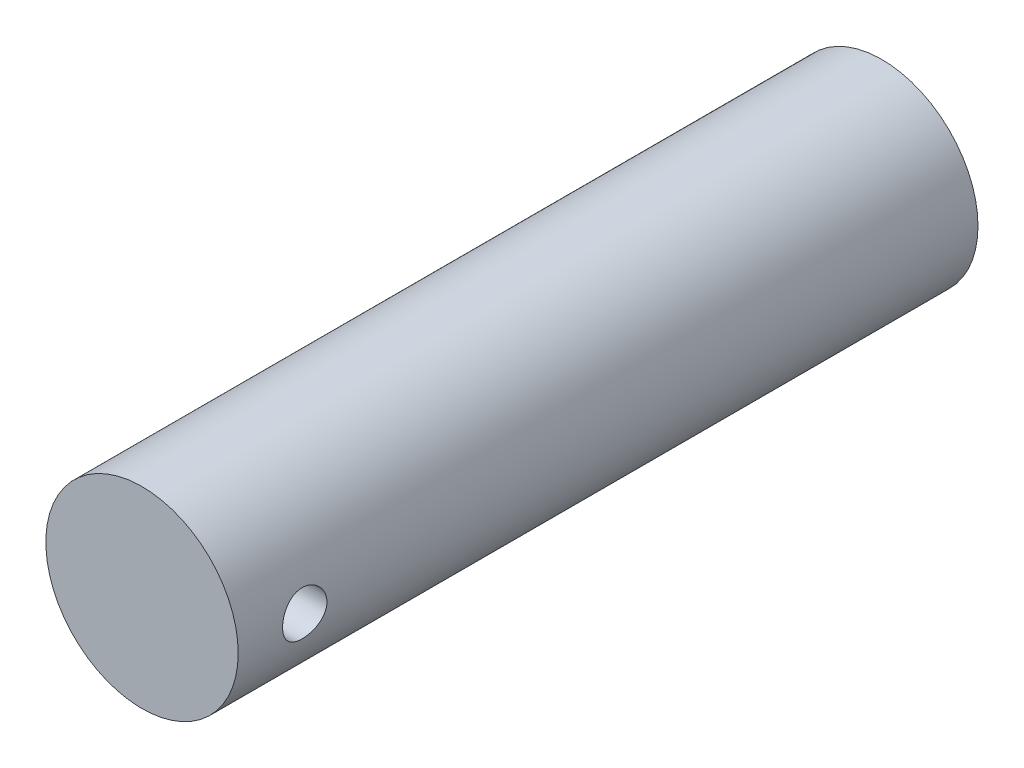
ISO-10303-21;
HEADER;
FILE_DESCRIPTION(('STEP AP214'),'2;1');
FILE_NAME('part.step','',(''),(''),'','','');
FILE_SCHEMA(('AUTOMOTIVE_DESIGN { 1 0 10303 214 1 1 1 1 }'));
ENDSEC;
DATA;
#1=APPLICATION_CONTEXT('core data for automotive mechanical design processes');
#2=APPLICATION_PROTOCOL_DEFINITION('international standard','automotive_design',2000,#1);
#3=PRODUCT_CONTEXT('',#1,'mechanical');
#4=PRODUCT('Part','Part','',(#3));
#5=PRODUCT_RELATED_PRODUCT_CATEGORY('part','',(#4));
#6=PRODUCT_DEFINITION_FORMATION('','',#4);
#7=PRODUCT_DEFINITION_CONTEXT('part definition',#1,'design');
#8=PRODUCT_DEFINITION('design','',#6,#7);
#9=PRODUCT_DEFINITION_SHAPE('','',#8);
#10=(LENGTH_UNIT() NAMED_UNIT(*) SI_UNIT(.MILLI.,.METRE.));
#11=(NAMED_UNIT(*) PLANE_ANGLE_UNIT() SI_UNIT($,.RADIAN.));
#12=(NAMED_UNIT(*) SI_UNIT($,.STERADIAN.) SOLID_ANGLE_UNIT());
#13=UNCERTAINTY_MEASURE_WITH_UNIT(LENGTH_MEASURE(1.E-05),#10,'distance_accuracy_value','');
#14=(GEOMETRIC_REPRESENTATION_CONTEXT(3) GLOBAL_UNCERTAINTY_ASSIGNED_CONTEXT((#13)) GLOBAL_UNIT_ASSIGNED_CONTEXT((#10,
#11,#12)) REPRESENTATION_CONTEXT('',''));
#15=CARTESIAN_POINT('',(0.,0.,0.));
#16=DIRECTION('',(0.,0.,1.));
#17=DIRECTION('',(1.,0.,0.));
#18=AXIS2_PLACEMENT_3D('',#15,#16,#17);
#19=CARTESIAN_POINT('',(0.,0.,50.));
#20=DIRECTION('',(0.,0.,-1.));
#21=DIRECTION('',(-1.,0.,0.));
#22=AXIS2_PLACEMENT_3D('',#19,#20,#21);
#23=CYLINDRICAL_SURFACE('',#22,6.5);
#24=CARTESIAN_POINT('',(-6.5,0.,44.));
#25=CARTESIAN_POINT('',(-6.49999849532867,0.0830761724763349,44.0000026653559));
#26=CARTESIAN_POINT('',(-6.49839124214547,0.166183602986828,44.0069249268111));
#27=CARTESIAN_POINT('',(-6.49213500375529,0.330029933246628,44.0343976428857));
#28=CARTESIAN_POINT('',(-6.48748401185166,0.410767233683363,44.0549570884414));
#29=CARTESIAN_POINT('',(-6.47565710646771,0.567482400649438,44.1090196989409));
#30=CARTESIAN_POINT('',(-6.46848397910972,0.643465410431955,44.1425085851314));
#31=CARTESIAN_POINT('',(-6.45238316831829,0.788732955280499,44.2214322650684));
#32=CARTESIAN_POINT('',(-6.44345549077589,0.858017512835939,44.2668670187059));
#33=CARTESIAN_POINT('',(-6.42464323305021,0.989152353123209,44.3692452516772));
#34=CARTESIAN_POINT('',(-6.41474568654138,1.05086679216121,44.4263603617025));
#35=CARTESIAN_POINT('',(-6.39519859507266,1.16393060397695,44.5501099265713));
#36=CARTESIAN_POINT('',(-6.38554907436474,1.2152789664991,44.6167453081605));
#37=CARTESIAN_POINT('',(-6.36746174180576,1.3067669575256,44.7586669275603));
#38=CARTESIAN_POINT('',(-6.35904049089481,1.34675925477788,44.8340504409768));
#39=CARTESIAN_POINT('',(-6.34455046029963,1.41345395330062,44.9906950986506));
#40=CARTESIAN_POINT('',(-6.33848136485541,1.44015813854149,45.0719554522451));
#41=CARTESIAN_POINT('',(-6.32951534623235,1.4790642425856,45.2365658015827));
#42=CARTESIAN_POINT('',(-6.32656557105072,1.4915080949688,45.3198556733748));
#43=CARTESIAN_POINT('',(-6.32401364937952,1.50229307046533,45.4873890870456));
#44=CARTESIAN_POINT('',(-6.32441104286173,1.50063613156309,45.5716324962828));
#45=CARTESIAN_POINT('',(-6.32846083321139,1.48346063285704,45.7368628078238));
#46=CARTESIAN_POINT('',(-6.33204661249555,1.46822575315179,45.8178810813439));
#47=CARTESIAN_POINT('',(-6.34196351386388,1.42477741479348,45.9761797919016));
#48=CARTESIAN_POINT('',(-6.34829480548987,1.39656315462671,46.0534599977771));
#49=CARTESIAN_POINT('',(-6.36305332227188,1.32770349075047,46.2028726716409));
#50=CARTESIAN_POINT('',(-6.37149843240945,1.28695129246528,46.274954080911));
#51=CARTESIAN_POINT('',(-6.38952239681953,1.19424748975256,46.4113592362894));
#52=CARTESIAN_POINT('',(-6.39910142196225,1.14229419645531,46.475681810259));
#53=CARTESIAN_POINT('',(-6.41859777640792,1.02717321086453,46.596373950051));
#54=CARTESIAN_POINT('',(-6.42851768847712,0.963764950845058,46.652513885125));
#55=CARTESIAN_POINT('',(-6.447368160694,0.828318641053408,46.7534030709754));
#56=CARTESIAN_POINT('',(-6.45629869876005,0.756280398745031,46.7981520675486));
#57=CARTESIAN_POINT('',(-6.47219854082993,0.605321277972372,46.8750559141433));
#58=CARTESIAN_POINT('',(-6.47916273202417,0.52638314329425,46.9071780156927));
#59=CARTESIAN_POINT('',(-6.49030757986402,0.364032396252585,46.9576361436951));
#60=CARTESIAN_POINT('',(-6.49448868821629,0.28062051237424,46.9759744073885));
#61=CARTESIAN_POINT('',(-6.49953102945198,0.113657323931641,46.9980041503482));
#62=CARTESIAN_POINT('',(-6.50046326526885,0.0301494450127298,47.0020089360597));
#63=CARTESIAN_POINT('',(-6.49910299913129,-0.136342371579224,46.9961109852407));
#64=CARTESIAN_POINT('',(-6.49681074208307,-0.219326348562746,46.986209304932));
#65=CARTESIAN_POINT('',(-6.48930412349636,-0.381357903798024,46.9530388033943));
#66=CARTESIAN_POINT('',(-6.48412623941868,-0.4604414648757,46.9299367586829));
#67=CARTESIAN_POINT('',(-6.47142910428788,-0.613609622481664,46.8712084110756));
#68=CARTESIAN_POINT('',(-6.4639096389422,-0.687693760726587,46.8355809618642));
#69=CARTESIAN_POINT('',(-6.44718996088191,-0.830037615110188,46.752177356079));
#70=CARTESIAN_POINT('',(-6.43796535296184,-0.898188410296328,46.7042203081148));
#71=CARTESIAN_POINT('',(-6.41890391913982,-1.02558718048179,46.5977543826415));
#72=CARTESIAN_POINT('',(-6.40906700421673,-1.08483385664763,46.5392439684584));
#73=CARTESIAN_POINT('',(-6.38964047483402,-1.19400102833017,46.411887614121));
#74=CARTESIAN_POINT('',(-6.38006017503739,-1.24370343589042,46.3428530353226));
#75=CARTESIAN_POINT('',(-6.36246188496285,-1.3308123544641,46.1972341197847));
#76=CARTESIAN_POINT('',(-6.35444382521927,-1.3682194122462,46.1206501189616));
#77=CARTESIAN_POINT('',(-6.34095951164845,-1.4294106686813,45.9625240115775));
#78=CARTESIAN_POINT('',(-6.33547846174878,-1.45327404481083,45.8810138703166));
#79=CARTESIAN_POINT('',(-6.3276660054956,-1.48692530676327,45.7149960071522));
#80=CARTESIAN_POINT('',(-6.32533402889436,-1.49671574099563,45.63048883081));
#81=CARTESIAN_POINT('',(-6.32412253425542,-1.50182536015786,45.4630817729474));
#82=CARTESIAN_POINT('',(-6.32516029248235,-1.49749127871472,45.3801928893514));
#83=CARTESIAN_POINT('',(-6.33038270361014,-1.47525685980882,45.2163613213318));
#84=CARTESIAN_POINT('',(-6.33456731037362,-1.45735672124419,45.1354186083924));
#85=CARTESIAN_POINT('',(-6.34556939165105,-1.40867420720144,44.9780900892089));
#86=CARTESIAN_POINT('',(-6.35237543592818,-1.37794771033572,44.9016861392942));
#87=CARTESIAN_POINT('',(-6.36785683112448,-1.30453082227101,44.7550681934587));
#88=CARTESIAN_POINT('',(-6.37653240158127,-1.26183902581515,44.6848549258726));
#89=CARTESIAN_POINT('',(-6.39501829374306,-1.16457679516264,44.5509144714099));
#90=CARTESIAN_POINT('',(-6.4048496868242,-1.10976162033288,44.4873678804504));
#91=CARTESIAN_POINT('',(-6.42440402438128,-0.990297714593216,44.3702617523617));
#92=CARTESIAN_POINT('',(-6.43412694306169,-0.925646696024382,44.3167045450697));
#93=CARTESIAN_POINT('',(-6.45253999299533,-0.787191932761555,44.2203327320512));
#94=CARTESIAN_POINT('',(-6.46121270567525,-0.71326686908489,44.1776888817102));
#95=CARTESIAN_POINT('',(-6.47637045552876,-0.559109641475373,44.1055008505914));
#96=CARTESIAN_POINT('',(-6.48285722936411,-0.478882547101938,44.0759462648971));
#97=CARTESIAN_POINT('',(-6.49182723396727,-0.33221037419877,44.0357215264443));
#98=CARTESIAN_POINT('',(-6.49487228966801,-0.26652636732101,44.022352728973));
#99=CARTESIAN_POINT('',(-6.4989592245111,-0.133901630280836,44.0044911333853));
#100=CARTESIAN_POINT('',(-6.5000012127936,-0.0669609687898311,43.9999978516727));
#101=CARTESIAN_POINT('',(-6.5,0.,44.));
#102=B_SPLINE_CURVE_WITH_KNOTS('',3,(#24,#25,#26,#27,#28,#29,#30,#31,#32,#33,#34,#35,#36,#37,
#38,#39,#40,#41,#42,#43,#44,#45,#46,#47,#48,#49,#50,#51,#52,#53,#54,#55,#56,#57,#58,#59,#60,#61,
#62,#63,#64,#65,#66,#67,#68,#69,#70,#71,#72,#73,#74,#75,#76,#77,#78,#79,#80,#81,#82,#83,#84,#85,
#86,#87,#88,#89,#90,#91,#92,#93,#94,#95,#96,#97,#98,#99,#100,#101),.UNSPECIFIED.,.T.,.F.,(4,2,2,
2,2,2,2,2,2,2,2,2,2,2,2,2,2,2,2,2,2,2,2,2,2,2,2,2,2,2,2,2,2,2,2,2,2,2,4),(0.,0.248983311217115,
0.4981309394311,0.747004202472743,0.9958766299172,1.24870930222222,1.50156660317464,
1.75756840109411,2.01353582069621,2.26509316141456,2.51661592915603,2.76300377758328,
3.00940684320485,3.25796969712266,3.50657005489343,3.76117526279511,4.01578615203543,
4.27105309773003,4.52627860236007,4.77589001432917,5.02548246887372,5.27198911757479,
5.51851833225483,5.76889433751053,6.01930682944869,6.27489540554878,6.53047261420163,
6.78453988631542,7.03856114466418,7.28639401438668,7.53422325058919,7.78098389306532,
8.02777352833803,8.28009323709709,8.53247172133004,8.78858609727299,9.04449651578223,
9.24519271684378,9.44587798236137),.UNSPECIFIED.);
#103=CARTESIAN_POINT('',(-6.5,0.,44.));
#104=VERTEX_POINT('',#103);
#105=EDGE_CURVE('E10',#104,#104,#102,.T.);
#106=ORIENTED_EDGE('',*,*,#105,.T.);
#107=EDGE_LOOP('',(#106));
#108=FACE_BOUND('',#107,.T.);
#109=CARTESIAN_POINT('',(6.5,0.,44.));
#110=CARTESIAN_POINT('',(6.49999849532867,-0.0830761724763349,44.0000026653559));
#111=CARTESIAN_POINT('',(6.49839124214547,-0.166183602986828,44.0069249268111));
#112=CARTESIAN_POINT('',(6.49213500375529,-0.330029933246628,44.0343976428857));
#113=CARTESIAN_POINT('',(6.48748401185166,-0.410767233683363,44.0549570884414));
#114=CARTESIAN_POINT('',(6.47565710646771,-0.567482400649438,44.1090196989409));
#115=CARTESIAN_POINT('',(6.46848397910972,-0.643465410431955,44.1425085851314));
#116=CARTESIAN_POINT('',(6.45238316831829,-0.788732955280499,44.2214322650684));
#117=CARTESIAN_POINT('',(6.44345549077589,-0.858017512835939,44.2668670187059));
#118=CARTESIAN_POINT('',(6.42464323305021,-0.989152353123208,44.3692452516772));
#119=CARTESIAN_POINT('',(6.41474568654138,-1.0508667921612,44.4263603617025));
#120=CARTESIAN_POINT('',(6.39519859507266,-1.16393060397695,44.5501099265713));
#121=CARTESIAN_POINT('',(6.38554907436474,-1.2152789664991,44.6167453081605));
#122=CARTESIAN_POINT('',(6.36746174180576,-1.3067669575256,44.7586669275603));
#123=CARTESIAN_POINT('',(6.35904049089481,-1.34675925477788,44.8340504409768));
#124=CARTESIAN_POINT('',(6.34455046029963,-1.41345395330062,44.9906950986506));
#125=CARTESIAN_POINT('',(6.33848136485541,-1.44015813854149,45.0719554522451));
#126=CARTESIAN_POINT('',(6.32951534623235,-1.4790642425856,45.2365658015827));
#127=CARTESIAN_POINT('',(6.32656557105072,-1.4915080949688,45.3198556733748));
#128=CARTESIAN_POINT('',(6.32401364937952,-1.50229307046533,45.4873890870456));
#129=CARTESIAN_POINT('',(6.32441104286173,-1.50063613156309,45.5716324962828));
#130=CARTESIAN_POINT('',(6.32846083321139,-1.48346063285704,45.7368628078238));
#131=CARTESIAN_POINT('',(6.33204661249555,-1.46822575315179,45.8178810813439));
#132=CARTESIAN_POINT('',(6.34196351386388,-1.42477741479348,45.9761797919016));
#133=CARTESIAN_POINT('',(6.34829480548987,-1.39656315462671,46.0534599977771));
#134=CARTESIAN_POINT('',(6.36305332227188,-1.32770349075047,46.2028726716409));
#135=CARTESIAN_POINT('',(6.37149843240945,-1.28695129246528,46.274954080911));
#136=CARTESIAN_POINT('',(6.38952239681953,-1.19424748975256,46.4113592362894));
#137=CARTESIAN_POINT('',(6.39910142196225,-1.14229419645531,46.475681810259));
#138=CARTESIAN_POINT('',(6.41859777640792,-1.02717321086453,46.596373950051));
#139=CARTESIAN_POINT('',(6.42851768847712,-0.963764950845058,46.652513885125));
#140=CARTESIAN_POINT('',(6.447368160694,-0.828318641053408,46.7534030709754));
#141=CARTESIAN_POINT('',(6.45629869876005,-0.756280398745031,46.7981520675486));
#142=CARTESIAN_POINT('',(6.47219854082993,-0.605321277972372,46.8750559141433));
#143=CARTESIAN_POINT('',(6.47916273202417,-0.52638314329425,46.9071780156927));
#144=CARTESIAN_POINT('',(6.49030757986402,-0.364032396252585,46.9576361436951));
#145=CARTESIAN_POINT('',(6.49448868821629,-0.28062051237424,46.9759744073885));
#146=CARTESIAN_POINT('',(6.49953102945198,-0.113657323931641,46.9980041503482));
#147=CARTESIAN_POINT('',(6.50046326526885,-0.0301494450127298,47.0020089360597));
#148=CARTESIAN_POINT('',(6.49910299913129,0.136342371579224,46.9961109852407));
#149=CARTESIAN_POINT('',(6.49681074208307,0.219326348562746,46.986209304932));
#150=CARTESIAN_POINT('',(6.48930412349636,0.381357903798024,46.9530388033943));
#151=CARTESIAN_POINT('',(6.48412623941868,0.4604414648757,46.9299367586829));
#152=CARTESIAN_POINT('',(6.47142910428788,0.613609622481664,46.8712084110756));
#153=CARTESIAN_POINT('',(6.4639096389422,0.687693760726587,46.8355809618642));
#154=CARTESIAN_POINT('',(6.44718996088191,0.830037615110188,46.752177356079));
#155=CARTESIAN_POINT('',(6.43796535296184,0.898188410296328,46.7042203081148));
#156=CARTESIAN_POINT('',(6.41890391913982,1.02558718048179,46.5977543826415));
#157=CARTESIAN_POINT('',(6.40906700421673,1.08483385664763,46.5392439684584));
#158=CARTESIAN_POINT('',(6.38964047483402,1.19400102833017,46.411887614121));
#159=CARTESIAN_POINT('',(6.38006017503739,1.24370343589042,46.3428530353226));
#160=CARTESIAN_POINT('',(6.36246188496285,1.3308123544641,46.1972341197847));
#161=CARTESIAN_POINT('',(6.35444382521927,1.3682194122462,46.1206501189616));
#162=CARTESIAN_POINT('',(6.34095951164845,1.4294106686813,45.9625240115775));
#163=CARTESIAN_POINT('',(6.33547846174878,1.45327404481083,45.8810138703166));
#164=CARTESIAN_POINT('',(6.3276660054956,1.48692530676327,45.7149960071522));
#165=CARTESIAN_POINT('',(6.32533402889436,1.49671574099563,45.63048883081));
#166=CARTESIAN_POINT('',(6.32412253425542,1.50182536015786,45.4630817729474));
#167=CARTESIAN_POINT('',(6.32516029248235,1.49749127871472,45.3801928893514));
#168=CARTESIAN_POINT('',(6.33038270361014,1.47525685980882,45.2163613213318));
#169=CARTESIAN_POINT('',(6.33456731037362,1.45735672124419,45.1354186083924));
#170=CARTESIAN_POINT('',(6.34556939165105,1.40867420720144,44.9780900892089));
#171=CARTESIAN_POINT('',(6.35237543592818,1.37794771033572,44.9016861392942));
#172=CARTESIAN_POINT('',(6.36785683112448,1.30453082227101,44.7550681934587));
#173=CARTESIAN_POINT('',(6.37653240158127,1.26183902581515,44.6848549258726));
#174=CARTESIAN_POINT('',(6.39501829374306,1.16457679516264,44.5509144714099));
#175=CARTESIAN_POINT('',(6.4048496868242,1.10976162033288,44.4873678804504));
#176=CARTESIAN_POINT('',(6.42440402438128,0.990297714593216,44.3702617523617));
#177=CARTESIAN_POINT('',(6.43412694306169,0.925646696024382,44.3167045450697));
#178=CARTESIAN_POINT('',(6.45253999299533,0.787191932761555,44.2203327320512));
#179=CARTESIAN_POINT('',(6.46121270567525,0.71326686908489,44.1776888817102));
#180=CARTESIAN_POINT('',(6.47637045552876,0.559109641475373,44.1055008505914));
#181=CARTESIAN_POINT('',(6.48285722936411,0.478882547101938,44.0759462648971));
#182=CARTESIAN_POINT('',(6.49182723396727,0.33221037419877,44.0357215264443));
#183=CARTESIAN_POINT('',(6.49487228966801,0.26652636732101,44.022352728973));
#184=CARTESIAN_POINT('',(6.4989592245111,0.133901630280836,44.0044911333853));
#185=CARTESIAN_POINT('',(6.5000012127936,0.0669609687898311,43.9999978516727));
#186=CARTESIAN_POINT('',(6.5,0.,44.));
#187=B_SPLINE_CURVE_WITH_KNOTS('',3,(#109,#110,#111,#112,#113,#114,#115,#116,#117,#118,#119,
#120,#121,#122,#123,#124,#125,#126,#127,#128,#129,#130,#131,#132,#133,#134,#135,#136,#137,#138,
#139,#140,#141,#142,#143,#144,#145,#146,#147,#148,#149,#150,#151,#152,#153,#154,#155,#156,#157,
#158,#159,#160,#161,#162,#163,#164,#165,#166,#167,#168,#169,#170,#171,#172,#173,#174,#175,#176,
#177,#178,#179,#180,#181,#182,#183,#184,#185,#186),.UNSPECIFIED.,.T.,.F.,(4,2,2,2,2,2,2,2,2,2,2,
2,2,2,2,2,2,2,2,2,2,2,2,2,2,2,2,2,2,2,2,2,2,2,2,2,2,2,4),(0.,0.248983311217115,0.4981309394311,
0.747004202472743,0.9958766299172,1.24870930222221,1.50156660317464,1.75756840109411,
2.01353582069621,2.26509316141457,2.51661592915603,2.76300377758328,3.00940684320485,
3.25796969712266,3.50657005489343,3.76117526279511,4.01578615203544,4.27105309773003,
4.52627860236007,4.77589001432917,5.02548246887372,5.27198911757479,5.51851833225483,
5.76889433751053,6.01930682944869,6.27489540554879,6.53047261420163,6.78453988631542,
7.03856114466418,7.28639401438668,7.53422325058919,7.78098389306532,8.02777352833803,
8.28009323709709,8.53247172133004,8.78858609727299,9.04449651578223,9.24519271684378,
9.44587798236137),.UNSPECIFIED.);
#188=CARTESIAN_POINT('',(6.5,0.,44.));
#189=VERTEX_POINT('',#188);
#190=EDGE_CURVE('E40',#189,#189,#187,.T.);
#191=ORIENTED_EDGE('',*,*,#190,.T.);
#192=EDGE_LOOP('',(#191));
#193=FACE_BOUND('',#192,.T.);
#194=CARTESIAN_POINT('',(0.,0.,50.));
#195=DIRECTION('',(0.,0.,1.));
#196=DIRECTION('',(1.,0.,0.));
#197=AXIS2_PLACEMENT_3D('',#194,#195,#196);
#198=CIRCLE('',#197,6.5);
#199=CARTESIAN_POINT('',(6.5,0.,50.));
#200=VERTEX_POINT('',#199);
#201=EDGE_CURVE('E44',#200,#200,#198,.T.);
#202=ORIENTED_EDGE('',*,*,#201,.F.);
#203=EDGE_LOOP('',(#202));
#204=FACE_BOUND('',#203,.T.);
#205=CARTESIAN_POINT('',(0.,0.,0.));
#206=DIRECTION('',(0.,0.,1.));
#207=DIRECTION('',(1.,0.,0.));
#208=AXIS2_PLACEMENT_3D('',#205,#206,#207);
#209=CIRCLE('',#208,6.5);
#210=CARTESIAN_POINT('',(6.5,0.,0.));
#211=VERTEX_POINT('',#210);
#212=EDGE_CURVE('E48',#211,#211,#209,.T.);
#213=ORIENTED_EDGE('',*,*,#212,.T.);
#214=EDGE_LOOP('',(#213));
#215=FACE_BOUND('',#214,.T.);
#216=ADVANCED_FACE('F30',(#108,#193,#204,#215),#23,.T.);
#217=CARTESIAN_POINT('',(0.,0.,50.));
#218=DIRECTION('',(0.,0.,1.));
#219=DIRECTION('',(1.,0.,0.));
#220=AXIS2_PLACEMENT_3D('',#217,#218,#219);
#221=PLANE('',#220);
#222=ORIENTED_EDGE('',*,*,#201,.T.);
#223=EDGE_LOOP('',(#222));
#224=FACE_BOUND('',#223,.T.);
#225=ADVANCED_FACE('F59',(#224),#221,.T.);
#226=CARTESIAN_POINT('',(0.,0.,0.));
#227=DIRECTION('',(0.,0.,1.));
#228=DIRECTION('',(1.,0.,0.));
#229=AXIS2_PLACEMENT_3D('',#226,#227,#228);
#230=PLANE('',#229);
#231=ORIENTED_EDGE('',*,*,#212,.F.);
#232=EDGE_LOOP('',(#231));
#233=FACE_BOUND('',#232,.T.);
#234=ADVANCED_FACE('F57',(#233),#230,.F.);
#235=CARTESIAN_POINT('',(-6.5,0.,45.5));
#236=DIRECTION('',(1.,0.,0.));
#237=DIRECTION('',(0.,0.,-1.));
#238=AXIS2_PLACEMENT_3D('',#235,#236,#237);
#239=CYLINDRICAL_SURFACE('',#238,1.5);
#240=ORIENTED_EDGE('',*,*,#190,.F.);
#241=EDGE_LOOP('',(#240));
#242=FACE_BOUND('',#241,.T.);
#243=ORIENTED_EDGE('',*,*,#105,.F.);
#244=EDGE_LOOP('',(#243));
#245=FACE_BOUND('',#244,.T.);
#246=ADVANCED_FACE('F53',(#242,#245),#239,.F.);
#247=CLOSED_SHELL('',(#216,#225,#234,#246));
#248=MANIFOLD_SOLID_BREP('B2',#247);
#249=ADVANCED_BREP_SHAPE_REPRESENTATION('',(#18,#248),#14);
#250=SHAPE_DEFINITION_REPRESENTATION(#9,#249);
ENDSEC;
END-ISO-10303-21;
